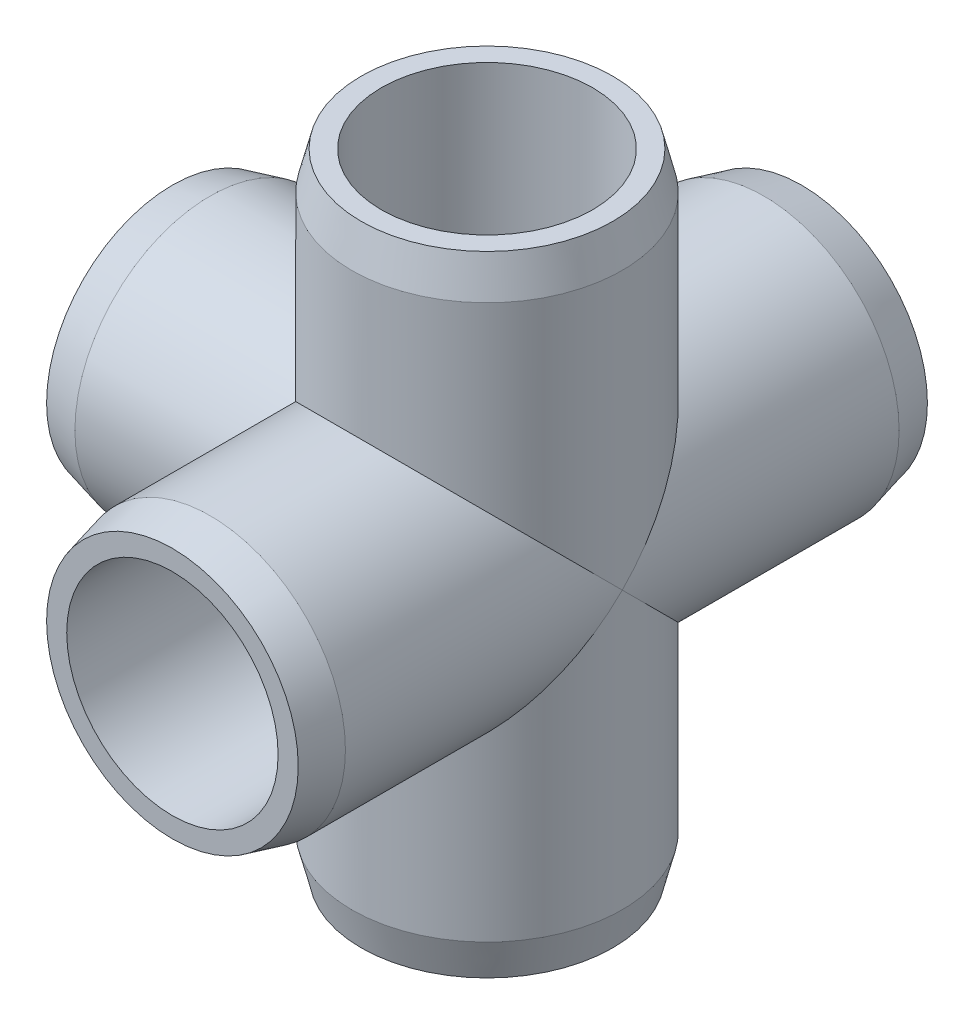
ISO-10303-21;
HEADER;
FILE_DESCRIPTION(('STEP AP214'),'2;1');
FILE_NAME('part.step','',(''),(''),'','','');
FILE_SCHEMA(('AUTOMOTIVE_DESIGN { 1 0 10303 214 1 1 1 1 }'));
ENDSEC;
DATA;
#1=APPLICATION_CONTEXT('core data for automotive mechanical design processes');
#2=APPLICATION_PROTOCOL_DEFINITION('international standard','automotive_design',2000,#1);
#3=PRODUCT_CONTEXT('',#1,'mechanical');
#4=PRODUCT('Part','Part','',(#3));
#5=PRODUCT_RELATED_PRODUCT_CATEGORY('part','',(#4));
#6=PRODUCT_DEFINITION_FORMATION('','',#4);
#7=PRODUCT_DEFINITION_CONTEXT('part definition',#1,'design');
#8=PRODUCT_DEFINITION('design','',#6,#7);
#9=PRODUCT_DEFINITION_SHAPE('','',#8);
#10=(LENGTH_UNIT() NAMED_UNIT(*) SI_UNIT(.MILLI.,.METRE.));
#11=(NAMED_UNIT(*) PLANE_ANGLE_UNIT() SI_UNIT($,.RADIAN.));
#12=(NAMED_UNIT(*) SI_UNIT($,.STERADIAN.) SOLID_ANGLE_UNIT());
#13=UNCERTAINTY_MEASURE_WITH_UNIT(LENGTH_MEASURE(1.E-05),#10,'distance_accuracy_value','');
#14=(GEOMETRIC_REPRESENTATION_CONTEXT(3) GLOBAL_UNCERTAINTY_ASSIGNED_CONTEXT((#13)) GLOBAL_UNIT_ASSIGNED_CONTEXT((#10,
#11,#12)) REPRESENTATION_CONTEXT('',''));
#15=CARTESIAN_POINT('',(0.,0.,0.));
#16=DIRECTION('',(0.,0.,1.));
#17=DIRECTION('',(1.,0.,0.));
#18=AXIS2_PLACEMENT_3D('',#15,#16,#17);
#19=CARTESIAN_POINT('',(-31.75,31.75,0.));
#20=DIRECTION('',(-1.,0.,0.));
#21=DIRECTION('',(0.,0.,1.));
#22=AXIS2_PLACEMENT_3D('',#19,#20,#21);
#23=CYLINDRICAL_SURFACE('',#22,10.4775);
#24=CARTESIAN_POINT('',(-12.7,31.75,0.));
#25=DIRECTION('',(-1.,0.,0.));
#26=DIRECTION('',(0.,0.,1.));
#27=AXIS2_PLACEMENT_3D('',#24,#25,#26);
#28=CIRCLE('',#27,10.4775);
#29=CARTESIAN_POINT('',(-12.7,31.75,10.4775));
#30=VERTEX_POINT('',#29);
#31=EDGE_CURVE('E54',#30,#30,#28,.T.);
#32=ORIENTED_EDGE('',*,*,#31,.F.);
#33=EDGE_LOOP('',(#32));
#34=FACE_BOUND('',#33,.T.);
#35=CARTESIAN_POINT('',(-10.795,31.75,0.));
#36=DIRECTION('',(-1.,0.,0.));
#37=DIRECTION('',(0.,0.,1.));
#38=AXIS2_PLACEMENT_3D('',#35,#36,#37);
#39=CIRCLE('',#38,10.4775);
#40=CARTESIAN_POINT('',(-10.795,31.75,10.4775));
#41=VERTEX_POINT('',#40);
#42=EDGE_CURVE('E11',#41,#41,#39,.T.);
#43=ORIENTED_EDGE('',*,*,#42,.T.);
#44=EDGE_LOOP('',(#43));
#45=FACE_BOUND('',#44,.T.);
#46=ADVANCED_FACE('F40',(#34,#45),#23,.T.);
#47=CARTESIAN_POINT('',(-10.795,42.2275,0.));
#48=DIRECTION('',(-1.,0.,0.));
#49=DIRECTION('',(0.,0.,1.));
#50=AXIS2_PLACEMENT_3D('',#47,#48,#49);
#51=PLANE('',#50);
#52=ORIENTED_EDGE('',*,*,#42,.F.);
#53=EDGE_LOOP('',(#52));
#54=FACE_BOUND('',#53,.T.);
#55=CARTESIAN_POINT('',(-10.795,31.75,0.));
#56=DIRECTION('',(-1.,0.,0.));
#57=DIRECTION('',(0.,0.,1.));
#58=AXIS2_PLACEMENT_3D('',#55,#56,#57);
#59=CIRCLE('',#58,9.2075);
#60=CARTESIAN_POINT('',(-10.795,31.75,9.2075));
#61=VERTEX_POINT('',#60);
#62=EDGE_CURVE('E46',#61,#61,#59,.T.);
#63=ORIENTED_EDGE('',*,*,#62,.T.);
#64=EDGE_LOOP('',(#63));
#65=FACE_BOUND('',#64,.T.);
#66=ADVANCED_FACE('F63',(#54,#65),#51,.F.);
#67=CARTESIAN_POINT('',(-31.75,31.75,0.));
#68=DIRECTION('',(-1.,0.,0.));
#69=DIRECTION('',(0.,0.,1.));
#70=AXIS2_PLACEMENT_3D('',#67,#68,#69);
#71=CYLINDRICAL_SURFACE('',#70,9.2075);
#72=ORIENTED_EDGE('',*,*,#62,.F.);
#73=EDGE_LOOP('',(#72));
#74=FACE_BOUND('',#73,.T.);
#75=CARTESIAN_POINT('',(-12.7,31.75,0.));
#76=DIRECTION('',(-1.,0.,0.));
#77=DIRECTION('',(0.,0.,1.));
#78=AXIS2_PLACEMENT_3D('',#75,#76,#77);
#79=CIRCLE('',#78,9.2075);
#80=CARTESIAN_POINT('',(-12.7,31.75,9.2075));
#81=VERTEX_POINT('',#80);
#82=EDGE_CURVE('E50',#81,#81,#79,.T.);
#83=ORIENTED_EDGE('',*,*,#82,.T.);
#84=EDGE_LOOP('',(#83));
#85=FACE_BOUND('',#84,.T.);
#86=ADVANCED_FACE('F67',(#74,#85),#71,.F.);
#87=CARTESIAN_POINT('',(-12.7,40.9575,0.));
#88=DIRECTION('',(1.,0.,0.));
#89=DIRECTION('',(0.,0.,-1.));
#90=AXIS2_PLACEMENT_3D('',#87,#88,#89);
#91=PLANE('',#90);
#92=ORIENTED_EDGE('',*,*,#82,.F.);
#93=EDGE_LOOP('',(#92));
#94=FACE_BOUND('',#93,.T.);
#95=ORIENTED_EDGE('',*,*,#31,.T.);
#96=EDGE_LOOP('',(#95));
#97=FACE_BOUND('',#96,.T.);
#98=ADVANCED_FACE('F60',(#94,#97),#91,.F.);
#99=CLOSED_SHELL('',(#46,#66,#86,#98));
#100=MANIFOLD_SOLID_BREP('B2',#99);
#101=CARTESIAN_POINT('',(0.,63.5,0.));
#102=DIRECTION('',(0.,-1.,0.));
#103=DIRECTION('',(0.,0.,-1.));
#104=AXIS2_PLACEMENT_3D('',#101,#102,#103);
#105=CYLINDRICAL_SURFACE('',#104,10.668);
#106=CARTESIAN_POINT('',(0.,31.75,0.));
#107=DIRECTION('',(-0.707106781186547,-0.707106781186547,0.));
#108=DIRECTION('',(0.707106781186547,-0.707106781186547,0.));
#109=AXIS2_PLACEMENT_3D('',#106,#107,#108);
#110=ELLIPSE('',#109,15.0868302833962,10.668);
#111=CARTESIAN_POINT('',(-7.54341514169809,39.2934151416981,-7.54341514169809));
#112=VERTEX_POINT('',#111);
#113=CARTESIAN_POINT('',(-7.54341514169809,39.2934151416981,7.54341514169808));
#114=VERTEX_POINT('',#113);
#115=EDGE_CURVE('E154',#112,#114,#110,.F.);
#116=ORIENTED_EDGE('',*,*,#115,.F.);
#117=CARTESIAN_POINT('',(0.,31.75,0.));
#118=DIRECTION('',(0.,0.707106781186548,0.707106781186547));
#119=DIRECTION('',(0.,-0.707106781186548,0.707106781186547));
#120=AXIS2_PLACEMENT_3D('',#117,#118,#119);
#121=ELLIPSE('',#120,15.0868302833962,10.668);
#122=CARTESIAN_POINT('',(10.668,31.75,0.));
#123=VERTEX_POINT('',#122);
#124=EDGE_CURVE('E151',#123,#112,#121,.T.);
#125=ORIENTED_EDGE('',*,*,#124,.F.);
#126=CARTESIAN_POINT('',(0.,31.75,0.));
#127=DIRECTION('',(0.,-0.707106781186548,0.707106781186547));
#128=DIRECTION('',(0.,0.707106781186548,0.707106781186547));
#129=AXIS2_PLACEMENT_3D('',#126,#127,#128);
#130=ELLIPSE('',#129,15.0868302833962,10.668);
#131=EDGE_CURVE('E38',#114,#123,#130,.F.);
#132=ORIENTED_EDGE('',*,*,#131,.F.);
#133=EDGE_LOOP('',(#116,#125,#132));
#134=FACE_BOUND('',#133,.T.);
#135=CARTESIAN_POINT('',(0.,42.545,0.));
#136=DIRECTION('',(0.,-1.,0.));
#137=DIRECTION('',(0.,0.,-1.));
#138=AXIS2_PLACEMENT_3D('',#135,#136,#137);
#139=CIRCLE('',#138,10.668);
#140=CARTESIAN_POINT('',(0.,42.545,-10.668));
#141=VERTEX_POINT('',#140);
#142=EDGE_CURVE('E275',#141,#141,#139,.T.);
#143=ORIENTED_EDGE('',*,*,#142,.F.);
#144=EDGE_LOOP('',(#143));
#145=FACE_BOUND('',#144,.T.);
#146=ADVANCED_FACE('F101',(#134,#145),#105,.F.);
#147=CARTESIAN_POINT('',(0.,63.5,0.));
#148=DIRECTION('',(0.,1.,0.));
#149=DIRECTION('',(0.,0.,1.));
#150=AXIS2_PLACEMENT_3D('',#147,#148,#149);
#151=CIRCLE('',#150,10.668);
#152=CARTESIAN_POINT('',(0.,63.5,10.668));
#153=VERTEX_POINT('',#152);
#154=EDGE_CURVE('E165',#153,#153,#151,.T.);
#155=ORIENTED_EDGE('',*,*,#154,.T.);
#156=EDGE_LOOP('',(#155));
#157=FACE_BOUND('',#156,.T.);
#158=CARTESIAN_POINT('',(0.,44.45,0.));
#159=DIRECTION('',(0.,-1.,0.));
#160=DIRECTION('',(0.,0.,-1.));
#161=AXIS2_PLACEMENT_3D('',#158,#159,#160);
#162=CIRCLE('',#161,10.668);
#163=CARTESIAN_POINT('',(0.,44.45,-10.668));
#164=VERTEX_POINT('',#163);
#165=EDGE_CURVE('E284',#164,#164,#162,.T.);
#166=ORIENTED_EDGE('',*,*,#165,.T.);
#167=EDGE_LOOP('',(#166));
#168=FACE_BOUND('',#167,.T.);
#169=ADVANCED_FACE('F288',(#157,#168),#105,.F.);
#170=CARTESIAN_POINT('',(0.,31.75,0.));
#171=DIRECTION('',(0.707106781186547,-0.707106781186547,0.));
#172=DIRECTION('',(-0.707106781186547,-0.707106781186547,0.));
#173=AXIS2_PLACEMENT_3D('',#170,#171,#172);
#174=ELLIPSE('',#173,15.0868302833962,10.668);
#175=CARTESIAN_POINT('',(-7.54341514169809,24.2065848583019,7.54341514169808));
#176=VERTEX_POINT('',#175);
#177=CARTESIAN_POINT('',(-7.54341514169809,24.2065848583019,-7.54341514169809));
#178=VERTEX_POINT('',#177);
#179=EDGE_CURVE('E116',#176,#178,#174,.T.);
#180=ORIENTED_EDGE('',*,*,#179,.F.);
#181=CARTESIAN_POINT('',(0.,31.75,0.));
#182=DIRECTION('',(0.,0.707106781186548,0.707106781186547));
#183=DIRECTION('',(0.,-0.707106781186548,0.707106781186547));
#184=AXIS2_PLACEMENT_3D('',#181,#182,#183);
#185=ELLIPSE('',#184,15.0868302833962,10.668);
#186=EDGE_CURVE('E159',#123,#176,#185,.F.);
#187=ORIENTED_EDGE('',*,*,#186,.F.);
#188=CARTESIAN_POINT('',(0.,31.75,0.));
#189=DIRECTION('',(0.,-0.707106781186548,0.707106781186547));
#190=DIRECTION('',(0.,0.707106781186548,0.707106781186547));
#191=AXIS2_PLACEMENT_3D('',#188,#189,#190);
#192=ELLIPSE('',#191,15.0868302833962,10.668);
#193=EDGE_CURVE('E109',#178,#123,#192,.T.);
#194=ORIENTED_EDGE('',*,*,#193,.F.);
#195=EDGE_LOOP('',(#180,#187,#194));
#196=FACE_BOUND('',#195,.T.);
#197=CARTESIAN_POINT('',(0.,20.955,0.));
#198=DIRECTION('',(0.,-1.,0.));
#199=DIRECTION('',(0.,0.,-1.));
#200=AXIS2_PLACEMENT_3D('',#197,#198,#199);
#201=CIRCLE('',#200,10.668);
#202=CARTESIAN_POINT('',(0.,20.955,-10.668));
#203=VERTEX_POINT('',#202);
#204=EDGE_CURVE('E263',#203,#203,#201,.T.);
#205=ORIENTED_EDGE('',*,*,#204,.T.);
#206=EDGE_LOOP('',(#205));
#207=FACE_BOUND('',#206,.T.);
#208=ADVANCED_FACE('F161',(#196,#207),#105,.F.);
#209=CARTESIAN_POINT('',(0.,0.,0.));
#210=DIRECTION('',(0.,1.,0.));
#211=DIRECTION('',(0.,0.,1.));
#212=AXIS2_PLACEMENT_3D('',#209,#210,#211);
#213=CIRCLE('',#212,10.668);
#214=CARTESIAN_POINT('',(0.,0.,10.668));
#215=VERTEX_POINT('',#214);
#216=EDGE_CURVE('E172',#215,#215,#213,.T.);
#217=ORIENTED_EDGE('',*,*,#216,.F.);
#218=EDGE_LOOP('',(#217));
#219=FACE_BOUND('',#218,.T.);
#220=CARTESIAN_POINT('',(0.,19.05,0.));
#221=DIRECTION('',(0.,-1.,0.));
#222=DIRECTION('',(0.,0.,-1.));
#223=AXIS2_PLACEMENT_3D('',#220,#221,#222);
#224=CIRCLE('',#223,10.668);
#225=CARTESIAN_POINT('',(0.,19.05,-10.668));
#226=VERTEX_POINT('',#225);
#227=EDGE_CURVE('E272',#226,#226,#224,.T.);
#228=ORIENTED_EDGE('',*,*,#227,.F.);
#229=EDGE_LOOP('',(#228));
#230=FACE_BOUND('',#229,.T.);
#231=ADVANCED_FACE('F303',(#219,#230),#105,.F.);
#232=CARTESIAN_POINT('',(0.,31.75,-38.1));
#233=DIRECTION('',(0.,0.,1.));
#234=DIRECTION('',(1.,0.,0.));
#235=AXIS2_PLACEMENT_3D('',#232,#233,#234);
#236=CYLINDRICAL_SURFACE('',#235,10.668);
#237=CARTESIAN_POINT('',(0.,31.75,12.7));
#238=DIRECTION('',(0.,0.,-1.));
#239=DIRECTION('',(0.,1.,0.));
#240=AXIS2_PLACEMENT_3D('',#237,#238,#239);
#241=CIRCLE('',#240,10.668);
#242=CARTESIAN_POINT('',(10.668,31.75,12.7));
#243=VERTEX_POINT('',#242);
#244=EDGE_CURVE('E251',#243,#243,#241,.T.);
#245=CARTESIAN_POINT('',(0.,31.75,31.75));
#246=DIRECTION('',(0.,0.,1.));
#247=DIRECTION('',(1.,0.,0.));
#248=AXIS2_PLACEMENT_3D('',#245,#246,#247);
#249=CIRCLE('',#248,10.668);
#250=CARTESIAN_POINT('',(10.668,31.75,31.75));
#251=VERTEX_POINT('',#250);
#252=EDGE_CURVE('E187',#251,#251,#249,.T.);
#253=CARTESIAN_POINT('',(10.668,31.75,12.7));
#254=CARTESIAN_POINT('',(10.668,31.75,12.8984375));
#255=CARTESIAN_POINT('',(10.668,31.75,13.096875));
#256=CARTESIAN_POINT('',(10.668,31.75,13.49375));
#257=CARTESIAN_POINT('',(10.668,31.75,13.6921875));
#258=CARTESIAN_POINT('',(10.668,31.75,14.0890625));
#259=CARTESIAN_POINT('',(10.668,31.75,14.2875));
#260=CARTESIAN_POINT('',(10.668,31.75,14.684375));
#261=CARTESIAN_POINT('',(10.668,31.75,14.8828125));
#262=CARTESIAN_POINT('',(10.668,31.75,15.2796875));
#263=CARTESIAN_POINT('',(10.668,31.75,15.478125));
#264=CARTESIAN_POINT('',(10.668,31.75,15.875));
#265=CARTESIAN_POINT('',(10.668,31.75,16.0734375));
#266=CARTESIAN_POINT('',(10.668,31.75,16.4703125));
#267=CARTESIAN_POINT('',(10.668,31.75,16.66875));
#268=CARTESIAN_POINT('',(10.668,31.75,17.065625));
#269=CARTESIAN_POINT('',(10.668,31.75,17.2640625));
#270=CARTESIAN_POINT('',(10.668,31.75,17.6609375));
#271=CARTESIAN_POINT('',(10.668,31.75,17.859375));
#272=CARTESIAN_POINT('',(10.668,31.75,18.25625));
#273=CARTESIAN_POINT('',(10.668,31.75,18.4546875));
#274=CARTESIAN_POINT('',(10.668,31.75,18.8515625));
#275=CARTESIAN_POINT('',(10.668,31.75,19.05));
#276=CARTESIAN_POINT('',(10.668,31.75,19.446875));
#277=CARTESIAN_POINT('',(10.668,31.75,19.6453125));
#278=CARTESIAN_POINT('',(10.668,31.75,20.0421875));
#279=CARTESIAN_POINT('',(10.668,31.75,20.240625));
#280=CARTESIAN_POINT('',(10.668,31.75,20.6375));
#281=CARTESIAN_POINT('',(10.668,31.75,20.8359375));
#282=CARTESIAN_POINT('',(10.668,31.75,21.2328125));
#283=CARTESIAN_POINT('',(10.668,31.75,21.43125));
#284=CARTESIAN_POINT('',(10.668,31.75,21.828125));
#285=CARTESIAN_POINT('',(10.668,31.75,22.0265625));
#286=CARTESIAN_POINT('',(10.668,31.75,22.4234375));
#287=CARTESIAN_POINT('',(10.668,31.75,22.621875));
#288=CARTESIAN_POINT('',(10.668,31.75,23.01875));
#289=CARTESIAN_POINT('',(10.668,31.75,23.2171875));
#290=CARTESIAN_POINT('',(10.668,31.75,23.6140625));
#291=CARTESIAN_POINT('',(10.668,31.75,23.8125));
#292=CARTESIAN_POINT('',(10.668,31.75,24.209375));
#293=CARTESIAN_POINT('',(10.668,31.75,24.4078125));
#294=CARTESIAN_POINT('',(10.668,31.75,24.8046875));
#295=CARTESIAN_POINT('',(10.668,31.75,25.003125));
#296=CARTESIAN_POINT('',(10.668,31.75,25.4));
#297=CARTESIAN_POINT('',(10.668,31.75,25.5984375));
#298=CARTESIAN_POINT('',(10.668,31.75,25.9953125));
#299=CARTESIAN_POINT('',(10.668,31.75,26.19375));
#300=CARTESIAN_POINT('',(10.668,31.75,26.590625));
#301=CARTESIAN_POINT('',(10.668,31.75,26.7890625));
#302=CARTESIAN_POINT('',(10.668,31.75,27.1859375));
#303=CARTESIAN_POINT('',(10.668,31.75,27.384375));
#304=CARTESIAN_POINT('',(10.668,31.75,27.78125));
#305=CARTESIAN_POINT('',(10.668,31.75,27.9796875));
#306=CARTESIAN_POINT('',(10.668,31.75,28.3765625));
#307=CARTESIAN_POINT('',(10.668,31.75,28.575));
#308=CARTESIAN_POINT('',(10.668,31.75,28.971875));
#309=CARTESIAN_POINT('',(10.668,31.75,29.1703125));
#310=CARTESIAN_POINT('',(10.668,31.75,29.5671875));
#311=CARTESIAN_POINT('',(10.668,31.75,29.765625));
#312=CARTESIAN_POINT('',(10.668,31.75,30.1625));
#313=CARTESIAN_POINT('',(10.668,31.75,30.3609375));
#314=CARTESIAN_POINT('',(10.668,31.75,30.7578125));
#315=CARTESIAN_POINT('',(10.668,31.75,30.95625));
#316=CARTESIAN_POINT('',(10.668,31.75,31.353125));
#317=CARTESIAN_POINT('',(10.668,31.75,31.5515625));
#318=CARTESIAN_POINT('',(10.668,31.75,31.75));
#319=B_SPLINE_CURVE_WITH_KNOTS('',3,(#253,#254,#255,#256,#257,#258,#259,#260,#261,#262,#263,
#264,#265,#266,#267,#268,#269,#270,#271,#272,#273,#274,#275,#276,#277,#278,#279,#280,#281,#282,
#283,#284,#285,#286,#287,#288,#289,#290,#291,#292,#293,#294,#295,#296,#297,#298,#299,#300,#301,
#302,#303,#304,#305,#306,#307,#308,#309,#310,#311,#312,#313,#314,#315,#316,#317,#318),
.UNSPECIFIED.,.F.,.F.,(4,2,2,2,2,2,2,2,2,2,2,2,2,2,2,2,2,2,2,2,2,2,2,2,2,2,2,2,2,2,2,2,4),(0.,
0.5953125,1.190625,1.7859375,2.38125,2.9765625,3.571875,4.1671875,4.7625,5.3578125,5.953125,
6.5484375,7.14375,7.7390625,8.334375,8.92968750000001,9.52500000000001,10.1203125,10.715625,
11.3109375,11.90625,12.5015625,13.096875,13.6921875,14.2875,14.8828125,15.478125,16.0734375,
16.66875,17.2640625,17.859375,18.4546875,19.05),.UNSPECIFIED.);
#320=EDGE_CURVE('BSEAM311',#243,#251,#319,.T.);
#321=ORIENTED_EDGE('',*,*,#244,.T.);
#322=ORIENTED_EDGE('',*,*,#252,.T.);
#323=ORIENTED_EDGE('',*,*,#320,.T.);
#324=ORIENTED_EDGE('',*,*,#320,.F.);
#325=EDGE_LOOP('',(#321,#323,#322,#324));
#326=FACE_BOUND('',#325,.T.);
#327=ADVANCED_FACE('F311',(#326),#236,.F.);
#328=CARTESIAN_POINT('',(0.,31.75,10.795));
#329=DIRECTION('',(0.,0.,-1.));
#330=DIRECTION('',(0.,1.,0.));
#331=AXIS2_PLACEMENT_3D('',#328,#329,#330);
#332=CIRCLE('',#331,10.668);
#333=CARTESIAN_POINT('',(0.,42.418,10.795));
#334=VERTEX_POINT('',#333);
#335=EDGE_CURVE('E260',#334,#334,#332,.T.);
#336=ORIENTED_EDGE('',*,*,#335,.F.);
#337=EDGE_LOOP('',(#336));
#338=FACE_BOUND('',#337,.T.);
#339=CARTESIAN_POINT('',(0.,31.75,0.));
#340=DIRECTION('',(0.707106781186548,0.,0.707106781186547));
#341=DIRECTION('',(-0.707106781186548,0.,0.707106781186547));
#342=AXIS2_PLACEMENT_3D('',#339,#340,#341);
#343=ELLIPSE('',#342,15.0868302833962,10.668);
#344=EDGE_CURVE('E168',#176,#114,#343,.F.);
#345=ORIENTED_EDGE('',*,*,#344,.T.);
#346=ORIENTED_EDGE('',*,*,#131,.T.);
#347=ORIENTED_EDGE('',*,*,#186,.T.);
#348=EDGE_LOOP('',(#345,#346,#347));
#349=FACE_BOUND('',#348,.T.);
#350=ADVANCED_FACE('F167',(#338,#349),#236,.F.);
#351=CARTESIAN_POINT('',(0.,63.5,0.));
#352=DIRECTION('',(0.,-1.,0.));
#353=DIRECTION('',(0.,0.,-1.));
#354=AXIS2_PLACEMENT_3D('',#351,#352,#353);
#355=CYLINDRICAL_SURFACE('',#354,13.6525);
#356=CARTESIAN_POINT('',(0.,31.75,0.));
#357=DIRECTION('',(-0.707106781186547,-0.707106781186547,0.));
#358=DIRECTION('',(-0.707106781186547,0.707106781186547,0.));
#359=AXIS2_PLACEMENT_3D('',#356,#357,#358);
#360=ELLIPSE('',#359,19.3075506602987,13.6525);
#361=CARTESIAN_POINT('',(-9.65377533014934,41.4037753301493,-9.65377533014934));
#362=VERTEX_POINT('',#361);
#363=CARTESIAN_POINT('',(-9.65377533014934,41.4037753301493,9.65377533014934));
#364=VERTEX_POINT('',#363);
#365=EDGE_CURVE('E124',#362,#364,#360,.F.);
#366=ORIENTED_EDGE('',*,*,#365,.T.);
#367=CARTESIAN_POINT('',(0.,31.75,0.));
#368=DIRECTION('',(0.,-0.707106781186547,0.707106781186547));
#369=DIRECTION('',(0.,-0.707106781186547,-0.707106781186547));
#370=AXIS2_PLACEMENT_3D('',#367,#368,#369);
#371=ELLIPSE('',#370,19.3075506602987,13.6525);
#372=CARTESIAN_POINT('',(13.6525,31.75,0.));
#373=VERTEX_POINT('',#372);
#374=EDGE_CURVE('E182',#373,#364,#371,.T.);
#375=ORIENTED_EDGE('',*,*,#374,.F.);
#376=CARTESIAN_POINT('',(0.,31.75,0.));
#377=DIRECTION('',(0.,-0.707106781186547,-0.707106781186547));
#378=DIRECTION('',(0.,-0.707106781186547,0.707106781186547));
#379=AXIS2_PLACEMENT_3D('',#376,#377,#378);
#380=ELLIPSE('',#379,19.3075506602987,13.6525);
#381=EDGE_CURVE('E180',#362,#373,#380,.T.);
#382=ORIENTED_EDGE('',*,*,#381,.F.);
#383=EDGE_LOOP('',(#366,#375,#382));
#384=FACE_BOUND('',#383,.T.);
#385=CARTESIAN_POINT('',(0.,59.69,0.));
#386=DIRECTION('',(0.,-1.,0.));
#387=DIRECTION('',(0.,0.,-1.));
#388=AXIS2_PLACEMENT_3D('',#385,#386,#387);
#389=CIRCLE('',#388,13.6525);
#390=CARTESIAN_POINT('',(0.,59.69,-13.6525));
#391=VERTEX_POINT('',#390);
#392=EDGE_CURVE('E227',#391,#391,#389,.T.);
#393=ORIENTED_EDGE('',*,*,#392,.T.);
#394=EDGE_LOOP('',(#393));
#395=FACE_BOUND('',#394,.T.);
#396=ADVANCED_FACE('F103',(#384,#395),#355,.T.);
#397=CARTESIAN_POINT('',(0.,63.5,0.));
#398=DIRECTION('',(0.,1.,0.));
#399=DIRECTION('',(0.,0.,1.));
#400=AXIS2_PLACEMENT_3D('',#397,#398,#399);
#401=PLANE('',#400);
#402=ORIENTED_EDGE('',*,*,#154,.F.);
#403=EDGE_LOOP('',(#402));
#404=FACE_BOUND('',#403,.T.);
#405=CARTESIAN_POINT('',(0.,63.5,0.));
#406=DIRECTION('',(0.,-1.,0.));
#407=DIRECTION('',(0.,0.,-1.));
#408=AXIS2_PLACEMENT_3D('',#405,#406,#407);
#409=CIRCLE('',#408,12.7);
#410=CARTESIAN_POINT('',(0.,63.5,-12.7));
#411=VERTEX_POINT('',#410);
#412=EDGE_CURVE('E230',#411,#411,#409,.T.);
#413=ORIENTED_EDGE('',*,*,#412,.F.);
#414=EDGE_LOOP('',(#413));
#415=FACE_BOUND('',#414,.T.);
#416=ADVANCED_FACE('F429',(#404,#415),#401,.T.);
#417=CARTESIAN_POINT('',(0.,31.75,0.));
#418=DIRECTION('',(-0.707106781186547,0.707106781186547,0.));
#419=DIRECTION('',(-0.707106781186547,-0.707106781186547,0.));
#420=AXIS2_PLACEMENT_3D('',#417,#418,#419);
#421=ELLIPSE('',#420,19.3075506602987,13.6525);
#422=CARTESIAN_POINT('',(-9.65377533014934,22.0962246698507,9.65377533014934));
#423=VERTEX_POINT('',#422);
#424=CARTESIAN_POINT('',(-9.65377533014934,22.0962246698507,-9.65377533014934));
#425=VERTEX_POINT('',#424);
#426=EDGE_CURVE('E203',#423,#425,#421,.F.);
#427=ORIENTED_EDGE('',*,*,#426,.T.);
#428=CARTESIAN_POINT('',(0.,31.75,0.));
#429=DIRECTION('',(0.,-0.707106781186547,0.707106781186547));
#430=DIRECTION('',(0.,-0.707106781186547,-0.707106781186547));
#431=AXIS2_PLACEMENT_3D('',#428,#429,#430);
#432=ELLIPSE('',#431,19.3075506602987,13.6525);
#433=EDGE_CURVE('E184',#373,#425,#432,.F.);
#434=ORIENTED_EDGE('',*,*,#433,.F.);
#435=CARTESIAN_POINT('',(0.,31.75,0.));
#436=DIRECTION('',(0.,-0.707106781186547,-0.707106781186547));
#437=DIRECTION('',(0.,-0.707106781186547,0.707106781186547));
#438=AXIS2_PLACEMENT_3D('',#435,#436,#437);
#439=ELLIPSE('',#438,19.3075506602987,13.6525);
#440=EDGE_CURVE('E175',#423,#373,#439,.F.);
#441=ORIENTED_EDGE('',*,*,#440,.F.);
#442=EDGE_LOOP('',(#427,#434,#441));
#443=FACE_BOUND('',#442,.T.);
#444=CARTESIAN_POINT('',(0.,3.81,0.));
#445=DIRECTION('',(0.,-1.,0.));
#446=DIRECTION('',(0.,0.,-1.));
#447=AXIS2_PLACEMENT_3D('',#444,#445,#446);
#448=CIRCLE('',#447,13.6525);
#449=CARTESIAN_POINT('',(0.,3.81,-13.6525));
#450=VERTEX_POINT('',#449);
#451=EDGE_CURVE('E221',#450,#450,#448,.T.);
#452=ORIENTED_EDGE('',*,*,#451,.F.);
#453=EDGE_LOOP('',(#452));
#454=FACE_BOUND('',#453,.T.);
#455=ADVANCED_FACE('F420',(#443,#454),#355,.T.);
#456=CARTESIAN_POINT('',(0.,0.,0.));
#457=DIRECTION('',(0.,1.,0.));
#458=DIRECTION('',(0.,0.,1.));
#459=AXIS2_PLACEMENT_3D('',#456,#457,#458);
#460=PLANE('',#459);
#461=ORIENTED_EDGE('',*,*,#216,.T.);
#462=EDGE_LOOP('',(#461));
#463=FACE_BOUND('',#462,.T.);
#464=CARTESIAN_POINT('',(0.,0.,0.));
#465=DIRECTION('',(0.,-1.,0.));
#466=DIRECTION('',(0.,0.,-1.));
#467=AXIS2_PLACEMENT_3D('',#464,#465,#466);
#468=CIRCLE('',#467,12.7);
#469=CARTESIAN_POINT('',(0.,0.,-12.7));
#470=VERTEX_POINT('',#469);
#471=EDGE_CURVE('E224',#470,#470,#468,.T.);
#472=ORIENTED_EDGE('',*,*,#471,.T.);
#473=EDGE_LOOP('',(#472));
#474=FACE_BOUND('',#473,.T.);
#475=ADVANCED_FACE('F415',(#463,#474),#460,.F.);
#476=CARTESIAN_POINT('',(0.,31.75,-12.7));
#477=DIRECTION('',(0.,0.,-1.));
#478=DIRECTION('',(0.,1.,0.));
#479=AXIS2_PLACEMENT_3D('',#476,#477,#478);
#480=CIRCLE('',#479,10.668);
#481=CARTESIAN_POINT('',(10.668,31.75,-12.7));
#482=VERTEX_POINT('',#481);
#483=EDGE_CURVE('E209',#482,#482,#480,.T.);
#484=CARTESIAN_POINT('',(0.,31.75,-31.75));
#485=DIRECTION('',(0.,0.,1.));
#486=DIRECTION('',(1.,0.,0.));
#487=AXIS2_PLACEMENT_3D('',#484,#485,#486);
#488=CIRCLE('',#487,10.668);
#489=CARTESIAN_POINT('',(10.668,31.75,-31.75));
#490=VERTEX_POINT('',#489);
#491=EDGE_CURVE('E188',#490,#490,#488,.T.);
#492=CARTESIAN_POINT('',(10.668,31.75,-12.7));
#493=CARTESIAN_POINT('',(10.668,31.75,-12.8984375));
#494=CARTESIAN_POINT('',(10.668,31.75,-13.096875));
#495=CARTESIAN_POINT('',(10.668,31.75,-13.49375));
#496=CARTESIAN_POINT('',(10.668,31.75,-13.6921875));
#497=CARTESIAN_POINT('',(10.668,31.75,-14.0890625));
#498=CARTESIAN_POINT('',(10.668,31.75,-14.2875));
#499=CARTESIAN_POINT('',(10.668,31.75,-14.684375));
#500=CARTESIAN_POINT('',(10.668,31.75,-14.8828125));
#501=CARTESIAN_POINT('',(10.668,31.75,-15.2796875));
#502=CARTESIAN_POINT('',(10.668,31.75,-15.478125));
#503=CARTESIAN_POINT('',(10.668,31.75,-15.875));
#504=CARTESIAN_POINT('',(10.668,31.75,-16.0734375));
#505=CARTESIAN_POINT('',(10.668,31.75,-16.4703125));
#506=CARTESIAN_POINT('',(10.668,31.75,-16.66875));
#507=CARTESIAN_POINT('',(10.668,31.75,-17.065625));
#508=CARTESIAN_POINT('',(10.668,31.75,-17.2640625));
#509=CARTESIAN_POINT('',(10.668,31.75,-17.6609375));
#510=CARTESIAN_POINT('',(10.668,31.75,-17.859375));
#511=CARTESIAN_POINT('',(10.668,31.75,-18.25625));
#512=CARTESIAN_POINT('',(10.668,31.75,-18.4546875));
#513=CARTESIAN_POINT('',(10.668,31.75,-18.8515625));
#514=CARTESIAN_POINT('',(10.668,31.75,-19.05));
#515=CARTESIAN_POINT('',(10.668,31.75,-19.446875));
#516=CARTESIAN_POINT('',(10.668,31.75,-19.6453125));
#517=CARTESIAN_POINT('',(10.668,31.75,-20.0421875));
#518=CARTESIAN_POINT('',(10.668,31.75,-20.240625));
#519=CARTESIAN_POINT('',(10.668,31.75,-20.6375));
#520=CARTESIAN_POINT('',(10.668,31.75,-20.8359375));
#521=CARTESIAN_POINT('',(10.668,31.75,-21.2328125));
#522=CARTESIAN_POINT('',(10.668,31.75,-21.43125));
#523=CARTESIAN_POINT('',(10.668,31.75,-21.828125));
#524=CARTESIAN_POINT('',(10.668,31.75,-22.0265625));
#525=CARTESIAN_POINT('',(10.668,31.75,-22.4234375));
#526=CARTESIAN_POINT('',(10.668,31.75,-22.621875));
#527=CARTESIAN_POINT('',(10.668,31.75,-23.01875));
#528=CARTESIAN_POINT('',(10.668,31.75,-23.2171875));
#529=CARTESIAN_POINT('',(10.668,31.75,-23.6140625));
#530=CARTESIAN_POINT('',(10.668,31.75,-23.8125));
#531=CARTESIAN_POINT('',(10.668,31.75,-24.209375));
#532=CARTESIAN_POINT('',(10.668,31.75,-24.4078125));
#533=CARTESIAN_POINT('',(10.668,31.75,-24.8046875));
#534=CARTESIAN_POINT('',(10.668,31.75,-25.003125));
#535=CARTESIAN_POINT('',(10.668,31.75,-25.4));
#536=CARTESIAN_POINT('',(10.668,31.75,-25.5984375));
#537=CARTESIAN_POINT('',(10.668,31.75,-25.9953125));
#538=CARTESIAN_POINT('',(10.668,31.75,-26.19375));
#539=CARTESIAN_POINT('',(10.668,31.75,-26.590625));
#540=CARTESIAN_POINT('',(10.668,31.75,-26.7890625));
#541=CARTESIAN_POINT('',(10.668,31.75,-27.1859375));
#542=CARTESIAN_POINT('',(10.668,31.75,-27.384375));
#543=CARTESIAN_POINT('',(10.668,31.75,-27.78125));
#544=CARTESIAN_POINT('',(10.668,31.75,-27.9796875));
#545=CARTESIAN_POINT('',(10.668,31.75,-28.3765625));
#546=CARTESIAN_POINT('',(10.668,31.75,-28.575));
#547=CARTESIAN_POINT('',(10.668,31.75,-28.971875));
#548=CARTESIAN_POINT('',(10.668,31.75,-29.1703125));
#549=CARTESIAN_POINT('',(10.668,31.75,-29.5671875));
#550=CARTESIAN_POINT('',(10.668,31.75,-29.765625));
#551=CARTESIAN_POINT('',(10.668,31.75,-30.1625));
#552=CARTESIAN_POINT('',(10.668,31.75,-30.3609375));
#553=CARTESIAN_POINT('',(10.668,31.75,-30.7578125));
#554=CARTESIAN_POINT('',(10.668,31.75,-30.95625));
#555=CARTESIAN_POINT('',(10.668,31.75,-31.353125));
#556=CARTESIAN_POINT('',(10.668,31.75,-31.5515625));
#557=CARTESIAN_POINT('',(10.668,31.75,-31.75));
#558=B_SPLINE_CURVE_WITH_KNOTS('',3,(#492,#493,#494,#495,#496,#497,#498,#499,#500,#501,#502,
#503,#504,#505,#506,#507,#508,#509,#510,#511,#512,#513,#514,#515,#516,#517,#518,#519,#520,#521,
#522,#523,#524,#525,#526,#527,#528,#529,#530,#531,#532,#533,#534,#535,#536,#537,#538,#539,#540,
#541,#542,#543,#544,#545,#546,#547,#548,#549,#550,#551,#552,#553,#554,#555,#556,#557),
.UNSPECIFIED.,.F.,.F.,(4,2,2,2,2,2,2,2,2,2,2,2,2,2,2,2,2,2,2,2,2,2,2,2,2,2,2,2,2,2,2,2,4),(0.,
0.5953125,1.190625,1.7859375,2.38125,2.9765625,3.571875,4.1671875,4.7625,5.3578125,5.953125,
6.5484375,7.14375,7.7390625,8.334375,8.92968750000001,9.52500000000001,10.1203125,10.715625,
11.3109375,11.90625,12.5015625,13.096875,13.6921875,14.2875,14.8828125,15.478125,16.0734375,
16.66875,17.2640625,17.859375,18.4546875,19.05),.UNSPECIFIED.);
#559=EDGE_CURVE('BSEAM397',#482,#490,#558,.T.);
#560=ORIENTED_EDGE('',*,*,#483,.F.);
#561=ORIENTED_EDGE('',*,*,#491,.F.);
#562=ORIENTED_EDGE('',*,*,#559,.T.);
#563=ORIENTED_EDGE('',*,*,#559,.F.);
#564=EDGE_LOOP('',(#560,#562,#561,#563));
#565=FACE_BOUND('',#564,.T.);
#566=ADVANCED_FACE('F397',(#565),#236,.F.);
#567=CARTESIAN_POINT('',(-69.85,31.75,0.));
#568=DIRECTION('',(1.,0.,0.));
#569=DIRECTION('',(0.,0.,-1.));
#570=AXIS2_PLACEMENT_3D('',#567,#568,#569);
#571=CYLINDRICAL_SURFACE('',#570,10.668);
#572=ORIENTED_EDGE('',*,*,#344,.F.);
#573=ORIENTED_EDGE('',*,*,#179,.T.);
#574=CARTESIAN_POINT('',(0.,31.75,0.));
#575=DIRECTION('',(-0.707106781186548,0.,0.707106781186547));
#576=DIRECTION('',(0.707106781186548,0.,0.707106781186547));
#577=AXIS2_PLACEMENT_3D('',#574,#575,#576);
#578=ELLIPSE('',#577,15.0868302833962,10.668);
#579=EDGE_CURVE('E170',#112,#178,#578,.T.);
#580=ORIENTED_EDGE('',*,*,#579,.F.);
#581=ORIENTED_EDGE('',*,*,#115,.T.);
#582=EDGE_LOOP('',(#572,#573,#580,#581));
#583=FACE_BOUND('',#582,.T.);
#584=CARTESIAN_POINT('',(-31.75,31.75,0.));
#585=DIRECTION('',(1.,0.,0.));
#586=DIRECTION('',(0.,0.,-1.));
#587=AXIS2_PLACEMENT_3D('',#584,#585,#586);
#588=CIRCLE('',#587,10.668);
#589=CARTESIAN_POINT('',(-31.75,31.75,-10.668));
#590=VERTEX_POINT('',#589);
#591=EDGE_CURVE('E205',#590,#590,#588,.T.);
#592=ORIENTED_EDGE('',*,*,#591,.F.);
#593=EDGE_LOOP('',(#592));
#594=FACE_BOUND('',#593,.T.);
#595=ADVANCED_FACE('F393',(#583,#594),#571,.F.);
#596=CARTESIAN_POINT('',(0.,31.75,31.75));
#597=DIRECTION('',(0.,0.,-1.));
#598=DIRECTION('',(-1.,0.,0.));
#599=AXIS2_PLACEMENT_3D('',#596,#597,#598);
#600=CYLINDRICAL_SURFACE('',#599,13.6525);
#601=CARTESIAN_POINT('',(0.,31.75,27.94));
#602=DIRECTION('',(0.,0.,-1.));
#603=DIRECTION('',(-1.,0.,0.));
#604=AXIS2_PLACEMENT_3D('',#601,#602,#603);
#605=CIRCLE('',#604,13.6525);
#606=CARTESIAN_POINT('',(-13.6525,31.75,27.94));
#607=VERTEX_POINT('',#606);
#608=EDGE_CURVE('E248',#607,#607,#605,.T.);
#609=ORIENTED_EDGE('',*,*,#608,.T.);
#610=EDGE_LOOP('',(#609));
#611=FACE_BOUND('',#610,.T.);
#612=CARTESIAN_POINT('',(0.,31.75,0.));
#613=DIRECTION('',(-0.707106781186547,0.,-0.707106781186547));
#614=DIRECTION('',(0.707106781186547,0.,-0.707106781186547));
#615=AXIS2_PLACEMENT_3D('',#612,#613,#614);
#616=ELLIPSE('',#615,19.3075506602987,13.6525);
#617=EDGE_CURVE('E197',#423,#364,#616,.T.);
#618=ORIENTED_EDGE('',*,*,#617,.F.);
#619=ORIENTED_EDGE('',*,*,#440,.T.);
#620=ORIENTED_EDGE('',*,*,#374,.T.);
#621=EDGE_LOOP('',(#618,#619,#620));
#622=FACE_BOUND('',#621,.T.);
#623=ADVANCED_FACE('F396',(#611,#622),#600,.T.);
#624=CARTESIAN_POINT('',(0.,31.75,-27.94));
#625=DIRECTION('',(0.,0.,-1.));
#626=DIRECTION('',(-1.,0.,0.));
#627=AXIS2_PLACEMENT_3D('',#624,#625,#626);
#628=CIRCLE('',#627,13.6525);
#629=CARTESIAN_POINT('',(-13.6525,31.75,-27.94));
#630=VERTEX_POINT('',#629);
#631=EDGE_CURVE('E236',#630,#630,#628,.T.);
#632=ORIENTED_EDGE('',*,*,#631,.F.);
#633=EDGE_LOOP('',(#632));
#634=FACE_BOUND('',#633,.T.);
#635=CARTESIAN_POINT('',(0.,31.75,0.));
#636=DIRECTION('',(0.707106781186547,0.,-0.707106781186547));
#637=DIRECTION('',(-0.707106781186547,0.,-0.707106781186547));
#638=AXIS2_PLACEMENT_3D('',#635,#636,#637);
#639=ELLIPSE('',#638,19.3075506602987,13.6525);
#640=EDGE_CURVE('E200',#362,#425,#639,.F.);
#641=ORIENTED_EDGE('',*,*,#640,.F.);
#642=ORIENTED_EDGE('',*,*,#381,.T.);
#643=ORIENTED_EDGE('',*,*,#433,.T.);
#644=EDGE_LOOP('',(#641,#642,#643));
#645=FACE_BOUND('',#644,.T.);
#646=ADVANCED_FACE('F403',(#634,#645),#600,.T.);
#647=CARTESIAN_POINT('',(0.,31.75,31.75));
#648=DIRECTION('',(0.,0.,1.));
#649=DIRECTION('',(1.,0.,0.));
#650=AXIS2_PLACEMENT_3D('',#647,#648,#649);
#651=PLANE('',#650);
#652=CARTESIAN_POINT('',(0.,31.75,31.75));
#653=DIRECTION('',(0.,0.,-1.));
#654=DIRECTION('',(-1.,0.,0.));
#655=AXIS2_PLACEMENT_3D('',#652,#653,#654);
#656=CIRCLE('',#655,12.7);
#657=CARTESIAN_POINT('',(-12.7,31.75,31.75));
#658=VERTEX_POINT('',#657);
#659=EDGE_CURVE('E245',#658,#658,#656,.T.);
#660=ORIENTED_EDGE('',*,*,#659,.F.);
#661=EDGE_LOOP('',(#660));
#662=FACE_BOUND('',#661,.T.);
#663=ORIENTED_EDGE('',*,*,#252,.F.);
#664=EDGE_LOOP('',(#663));
#665=FACE_BOUND('',#664,.T.);
#666=ADVANCED_FACE('F399',(#662,#665),#651,.T.);
#667=CARTESIAN_POINT('',(0.,31.75,-31.75));
#668=DIRECTION('',(0.,0.,1.));
#669=DIRECTION('',(1.,0.,0.));
#670=AXIS2_PLACEMENT_3D('',#667,#668,#669);
#671=PLANE('',#670);
#672=CARTESIAN_POINT('',(0.,31.75,-31.75));
#673=DIRECTION('',(0.,0.,-1.));
#674=DIRECTION('',(-1.,0.,0.));
#675=AXIS2_PLACEMENT_3D('',#672,#673,#674);
#676=CIRCLE('',#675,12.7);
#677=CARTESIAN_POINT('',(-12.7,31.75,-31.75));
#678=VERTEX_POINT('',#677);
#679=EDGE_CURVE('E233',#678,#678,#676,.T.);
#680=ORIENTED_EDGE('',*,*,#679,.T.);
#681=EDGE_LOOP('',(#680));
#682=FACE_BOUND('',#681,.T.);
#683=ORIENTED_EDGE('',*,*,#491,.T.);
#684=EDGE_LOOP('',(#683));
#685=FACE_BOUND('',#684,.T.);
#686=ADVANCED_FACE('F402',(#682,#685),#671,.F.);
#687=CARTESIAN_POINT('',(0.,31.75,-10.795));
#688=DIRECTION('',(0.,0.,-1.));
#689=DIRECTION('',(0.,1.,0.));
#690=AXIS2_PLACEMENT_3D('',#687,#688,#689);
#691=CIRCLE('',#690,10.668);
#692=CARTESIAN_POINT('',(0.,42.418,-10.795));
#693=VERTEX_POINT('',#692);
#694=EDGE_CURVE('E218',#693,#693,#691,.T.);
#695=ORIENTED_EDGE('',*,*,#694,.T.);
#696=EDGE_LOOP('',(#695));
#697=FACE_BOUND('',#696,.T.);
#698=ORIENTED_EDGE('',*,*,#579,.T.);
#699=ORIENTED_EDGE('',*,*,#193,.T.);
#700=ORIENTED_EDGE('',*,*,#124,.T.);
#701=EDGE_LOOP('',(#698,#699,#700));
#702=FACE_BOUND('',#701,.T.);
#703=ADVANCED_FACE('F169',(#697,#702),#236,.F.);
#704=CARTESIAN_POINT('',(13.6535,31.75,0.));
#705=DIRECTION('',(-1.,0.,0.));
#706=DIRECTION('',(0.,0.,1.));
#707=AXIS2_PLACEMENT_3D('',#704,#705,#706);
#708=CYLINDRICAL_SURFACE('',#707,13.6525);
#709=CARTESIAN_POINT('',(-27.94,31.75,0.));
#710=DIRECTION('',(-1.,0.,0.));
#711=DIRECTION('',(0.,0.,1.));
#712=AXIS2_PLACEMENT_3D('',#709,#710,#711);
#713=CIRCLE('',#712,13.6525);
#714=CARTESIAN_POINT('',(-27.94,31.75,13.6525));
#715=VERTEX_POINT('',#714);
#716=EDGE_CURVE('E242',#715,#715,#713,.T.);
#717=ORIENTED_EDGE('',*,*,#716,.F.);
#718=EDGE_LOOP('',(#717));
#719=FACE_BOUND('',#718,.T.);
#720=ORIENTED_EDGE('',*,*,#426,.F.);
#721=ORIENTED_EDGE('',*,*,#617,.T.);
#722=ORIENTED_EDGE('',*,*,#365,.F.);
#723=ORIENTED_EDGE('',*,*,#640,.T.);
#724=EDGE_LOOP('',(#720,#721,#722,#723));
#725=FACE_BOUND('',#724,.T.);
#726=ADVANCED_FACE('F388',(#719,#725),#708,.T.);
#727=CARTESIAN_POINT('',(-31.75,31.75,0.));
#728=DIRECTION('',(1.,0.,0.));
#729=DIRECTION('',(0.,0.,-1.));
#730=AXIS2_PLACEMENT_3D('',#727,#728,#729);
#731=PLANE('',#730);
#732=CARTESIAN_POINT('',(-31.75,31.75,0.));
#733=DIRECTION('',(-1.,0.,0.));
#734=DIRECTION('',(0.,0.,1.));
#735=AXIS2_PLACEMENT_3D('',#732,#733,#734);
#736=CIRCLE('',#735,12.7);
#737=CARTESIAN_POINT('',(-31.75,31.75,12.7));
#738=VERTEX_POINT('',#737);
#739=EDGE_CURVE('E239',#738,#738,#736,.T.);
#740=ORIENTED_EDGE('',*,*,#739,.T.);
#741=EDGE_LOOP('',(#740));
#742=FACE_BOUND('',#741,.T.);
#743=ORIENTED_EDGE('',*,*,#591,.T.);
#744=EDGE_LOOP('',(#743));
#745=FACE_BOUND('',#744,.T.);
#746=ADVANCED_FACE('F384',(#742,#745),#731,.F.);
#747=CARTESIAN_POINT('',(0.,42.418,-12.7));
#748=DIRECTION('',(0.,0.,-1.));
#749=DIRECTION('',(0.,1.,0.));
#750=AXIS2_PLACEMENT_3D('',#747,#748,#749);
#751=PLANE('',#750);
#752=ORIENTED_EDGE('',*,*,#483,.T.);
#753=EDGE_LOOP('',(#752));
#754=FACE_BOUND('',#753,.T.);
#755=CARTESIAN_POINT('',(0.,31.75,-12.7));
#756=DIRECTION('',(0.,0.,-1.));
#757=DIRECTION('',(0.,1.,0.));
#758=AXIS2_PLACEMENT_3D('',#755,#756,#757);
#759=CIRCLE('',#758,9.398);
#760=CARTESIAN_POINT('',(0.,41.148,-12.7));
#761=VERTEX_POINT('',#760);
#762=EDGE_CURVE('E212',#761,#761,#759,.T.);
#763=ORIENTED_EDGE('',*,*,#762,.F.);
#764=EDGE_LOOP('',(#763));
#765=FACE_BOUND('',#764,.T.);
#766=ADVANCED_FACE('F380',(#754,#765),#751,.T.);
#767=CARTESIAN_POINT('',(0.,31.75,-31.75));
#768=DIRECTION('',(0.,0.,-1.));
#769=DIRECTION('',(0.,1.,0.));
#770=AXIS2_PLACEMENT_3D('',#767,#768,#769);
#771=CYLINDRICAL_SURFACE('',#770,9.398);
#772=ORIENTED_EDGE('',*,*,#762,.T.);
#773=EDGE_LOOP('',(#772));
#774=FACE_BOUND('',#773,.T.);
#775=CARTESIAN_POINT('',(0.,31.75,-10.795));
#776=DIRECTION('',(0.,0.,-1.));
#777=DIRECTION('',(0.,1.,0.));
#778=AXIS2_PLACEMENT_3D('',#775,#776,#777);
#779=CIRCLE('',#778,9.398);
#780=CARTESIAN_POINT('',(0.,41.148,-10.795));
#781=VERTEX_POINT('',#780);
#782=EDGE_CURVE('E215',#781,#781,#779,.T.);
#783=ORIENTED_EDGE('',*,*,#782,.F.);
#784=EDGE_LOOP('',(#783));
#785=FACE_BOUND('',#784,.T.);
#786=ADVANCED_FACE('F376',(#774,#785),#771,.F.);
#787=CARTESIAN_POINT('',(0.,41.148,-10.795));
#788=DIRECTION('',(0.,0.,1.));
#789=DIRECTION('',(0.,-1.,0.));
#790=AXIS2_PLACEMENT_3D('',#787,#788,#789);
#791=PLANE('',#790);
#792=ORIENTED_EDGE('',*,*,#782,.T.);
#793=EDGE_LOOP('',(#792));
#794=FACE_BOUND('',#793,.T.);
#795=ORIENTED_EDGE('',*,*,#694,.F.);
#796=EDGE_LOOP('',(#795));
#797=FACE_BOUND('',#796,.T.);
#798=ADVANCED_FACE('F372',(#794,#797),#791,.T.);
#799=CARTESIAN_POINT('',(0.,0.,0.));
#800=DIRECTION('',(0.,1.,0.));
#801=DIRECTION('',(0.,0.,1.));
#802=AXIS2_PLACEMENT_3D('',#799,#800,#801);
#803=CONICAL_SURFACE('',#802,12.7,0.244978663126864);
#804=ORIENTED_EDGE('',*,*,#451,.T.);
#805=EDGE_LOOP('',(#804));
#806=FACE_BOUND('',#805,.T.);
#807=ORIENTED_EDGE('',*,*,#471,.F.);
#808=EDGE_LOOP('',(#807));
#809=FACE_BOUND('',#808,.T.);
#810=ADVANCED_FACE('F368',(#806,#809),#803,.T.);
#811=CARTESIAN_POINT('',(0.,63.5,0.));
#812=DIRECTION('',(0.,-1.,0.));
#813=DIRECTION('',(0.,0.,1.));
#814=AXIS2_PLACEMENT_3D('',#811,#812,#813);
#815=CONICAL_SURFACE('',#814,12.7,0.244978663126864);
#816=ORIENTED_EDGE('',*,*,#392,.F.);
#817=EDGE_LOOP('',(#816));
#818=FACE_BOUND('',#817,.T.);
#819=ORIENTED_EDGE('',*,*,#412,.T.);
#820=EDGE_LOOP('',(#819));
#821=FACE_BOUND('',#820,.T.);
#822=ADVANCED_FACE('F364',(#818,#821),#815,.T.);
#823=CARTESIAN_POINT('',(0.,31.75,-27.94));
#824=DIRECTION('',(0.,0.,1.));
#825=DIRECTION('',(1.,0.,0.));
#826=AXIS2_PLACEMENT_3D('',#823,#824,#825);
#827=CONICAL_SURFACE('',#826,13.6525,0.244978663126864);
#828=ORIENTED_EDGE('',*,*,#679,.F.);
#829=EDGE_LOOP('',(#828));
#830=FACE_BOUND('',#829,.T.);
#831=ORIENTED_EDGE('',*,*,#631,.T.);
#832=EDGE_LOOP('',(#831));
#833=FACE_BOUND('',#832,.T.);
#834=ADVANCED_FACE('F360',(#830,#833),#827,.T.);
#835=CARTESIAN_POINT('',(-27.94,31.75,0.));
#836=DIRECTION('',(1.,0.,0.));
#837=DIRECTION('',(0.,0.,-1.));
#838=AXIS2_PLACEMENT_3D('',#835,#836,#837);
#839=CONICAL_SURFACE('',#838,13.6525,0.244978663126864);
#840=ORIENTED_EDGE('',*,*,#739,.F.);
#841=EDGE_LOOP('',(#840));
#842=FACE_BOUND('',#841,.T.);
#843=ORIENTED_EDGE('',*,*,#716,.T.);
#844=EDGE_LOOP('',(#843));
#845=FACE_BOUND('',#844,.T.);
#846=ADVANCED_FACE('F356',(#842,#845),#839,.T.);
#847=CARTESIAN_POINT('',(0.,31.75,27.94));
#848=DIRECTION('',(0.,0.,-1.));
#849=DIRECTION('',(1.,0.,0.));
#850=AXIS2_PLACEMENT_3D('',#847,#848,#849);
#851=CONICAL_SURFACE('',#850,13.6525,0.244978663126864);
#852=ORIENTED_EDGE('',*,*,#659,.T.);
#853=EDGE_LOOP('',(#852));
#854=FACE_BOUND('',#853,.T.);
#855=ORIENTED_EDGE('',*,*,#608,.F.);
#856=EDGE_LOOP('',(#855));
#857=FACE_BOUND('',#856,.T.);
#858=ADVANCED_FACE('F352',(#854,#857),#851,.T.);
#859=CARTESIAN_POINT('',(0.,42.418,12.7));
#860=DIRECTION('',(0.,0.,1.));
#861=DIRECTION('',(0.,1.,0.));
#862=AXIS2_PLACEMENT_3D('',#859,#860,#861);
#863=PLANE('',#862);
#864=ORIENTED_EDGE('',*,*,#244,.F.);
#865=EDGE_LOOP('',(#864));
#866=FACE_BOUND('',#865,.T.);
#867=CARTESIAN_POINT('',(0.,31.75,12.7));
#868=DIRECTION('',(0.,0.,-1.));
#869=DIRECTION('',(0.,1.,0.));
#870=AXIS2_PLACEMENT_3D('',#867,#868,#869);
#871=CIRCLE('',#870,9.398);
#872=CARTESIAN_POINT('',(0.,41.148,12.7));
#873=VERTEX_POINT('',#872);
#874=EDGE_CURVE('E254',#873,#873,#871,.T.);
#875=ORIENTED_EDGE('',*,*,#874,.T.);
#876=EDGE_LOOP('',(#875));
#877=FACE_BOUND('',#876,.T.);
#878=ADVANCED_FACE('F348',(#866,#877),#863,.T.);
#879=CARTESIAN_POINT('',(0.,31.75,31.75));
#880=DIRECTION('',(0.,0.,1.));
#881=DIRECTION('',(0.,1.,0.));
#882=AXIS2_PLACEMENT_3D('',#879,#880,#881);
#883=CYLINDRICAL_SURFACE('',#882,9.398);
#884=ORIENTED_EDGE('',*,*,#874,.F.);
#885=EDGE_LOOP('',(#884));
#886=FACE_BOUND('',#885,.T.);
#887=CARTESIAN_POINT('',(0.,31.75,10.795));
#888=DIRECTION('',(0.,0.,-1.));
#889=DIRECTION('',(0.,1.,0.));
#890=AXIS2_PLACEMENT_3D('',#887,#888,#889);
#891=CIRCLE('',#890,9.398);
#892=CARTESIAN_POINT('',(0.,41.148,10.795));
#893=VERTEX_POINT('',#892);
#894=EDGE_CURVE('E257',#893,#893,#891,.T.);
#895=ORIENTED_EDGE('',*,*,#894,.T.);
#896=EDGE_LOOP('',(#895));
#897=FACE_BOUND('',#896,.T.);
#898=ADVANCED_FACE('F344',(#886,#897),#883,.F.);
#899=CARTESIAN_POINT('',(0.,41.148,10.795));
#900=DIRECTION('',(0.,0.,-1.));
#901=DIRECTION('',(0.,-1.,0.));
#902=AXIS2_PLACEMENT_3D('',#899,#900,#901);
#903=PLANE('',#902);
#904=ORIENTED_EDGE('',*,*,#894,.F.);
#905=EDGE_LOOP('',(#904));
#906=FACE_BOUND('',#905,.T.);
#907=ORIENTED_EDGE('',*,*,#335,.T.);
#908=EDGE_LOOP('',(#907));
#909=FACE_BOUND('',#908,.T.);
#910=ADVANCED_FACE('F340',(#906,#909),#903,.T.);
#911=CARTESIAN_POINT('',(0.,20.955,10.668));
#912=DIRECTION('',(0.,-1.,0.));
#913=DIRECTION('',(0.,0.,-1.));
#914=AXIS2_PLACEMENT_3D('',#911,#912,#913);
#915=PLANE('',#914);
#916=ORIENTED_EDGE('',*,*,#204,.F.);
#917=EDGE_LOOP('',(#916));
#918=FACE_BOUND('',#917,.T.);
#919=CARTESIAN_POINT('',(0.,20.955,0.));
#920=DIRECTION('',(0.,-1.,0.));
#921=DIRECTION('',(0.,0.,-1.));
#922=AXIS2_PLACEMENT_3D('',#919,#920,#921);
#923=CIRCLE('',#922,9.398);
#924=CARTESIAN_POINT('',(0.,20.955,-9.398));
#925=VERTEX_POINT('',#924);
#926=EDGE_CURVE('E266',#925,#925,#923,.T.);
#927=ORIENTED_EDGE('',*,*,#926,.T.);
#928=EDGE_LOOP('',(#927));
#929=FACE_BOUND('',#928,.T.);
#930=ADVANCED_FACE('F333',(#918,#929),#915,.F.);
#931=CARTESIAN_POINT('',(0.,0.,0.));
#932=DIRECTION('',(0.,-1.,0.));
#933=DIRECTION('',(0.,0.,-1.));
#934=AXIS2_PLACEMENT_3D('',#931,#932,#933);
#935=CYLINDRICAL_SURFACE('',#934,9.398);
#936=ORIENTED_EDGE('',*,*,#926,.F.);
#937=EDGE_LOOP('',(#936));
#938=FACE_BOUND('',#937,.T.);
#939=CARTESIAN_POINT('',(0.,19.05,0.));
#940=DIRECTION('',(0.,-1.,0.));
#941=DIRECTION('',(0.,0.,-1.));
#942=AXIS2_PLACEMENT_3D('',#939,#940,#941);
#943=CIRCLE('',#942,9.398);
#944=CARTESIAN_POINT('',(0.,19.05,-9.398));
#945=VERTEX_POINT('',#944);
#946=EDGE_CURVE('E269',#945,#945,#943,.T.);
#947=ORIENTED_EDGE('',*,*,#946,.T.);
#948=EDGE_LOOP('',(#947));
#949=FACE_BOUND('',#948,.T.);
#950=ADVANCED_FACE('F324',(#938,#949),#935,.F.);
#951=CARTESIAN_POINT('',(0.,19.05,9.398));
#952=DIRECTION('',(0.,1.,0.));
#953=DIRECTION('',(0.,0.,1.));
#954=AXIS2_PLACEMENT_3D('',#951,#952,#953);
#955=PLANE('',#954);
#956=ORIENTED_EDGE('',*,*,#946,.F.);
#957=EDGE_LOOP('',(#956));
#958=FACE_BOUND('',#957,.T.);
#959=ORIENTED_EDGE('',*,*,#227,.T.);
#960=EDGE_LOOP('',(#959));
#961=FACE_BOUND('',#960,.T.);
#962=ADVANCED_FACE('F322',(#958,#961),#955,.F.);
#963=CARTESIAN_POINT('',(0.,42.545,10.668));
#964=DIRECTION('',(0.,1.,0.));
#965=DIRECTION('',(0.,0.,-1.));
#966=AXIS2_PLACEMENT_3D('',#963,#964,#965);
#967=PLANE('',#966);
#968=ORIENTED_EDGE('',*,*,#142,.T.);
#969=EDGE_LOOP('',(#968));
#970=FACE_BOUND('',#969,.T.);
#971=CARTESIAN_POINT('',(0.,42.545,0.));
#972=DIRECTION('',(0.,-1.,0.));
#973=DIRECTION('',(0.,0.,-1.));
#974=AXIS2_PLACEMENT_3D('',#971,#972,#973);
#975=CIRCLE('',#974,9.398);
#976=CARTESIAN_POINT('',(0.,42.545,-9.398));
#977=VERTEX_POINT('',#976);
#978=EDGE_CURVE('E278',#977,#977,#975,.T.);
#979=ORIENTED_EDGE('',*,*,#978,.F.);
#980=EDGE_LOOP('',(#979));
#981=FACE_BOUND('',#980,.T.);
#982=ADVANCED_FACE('F298',(#970,#981),#967,.F.);
#983=CARTESIAN_POINT('',(0.,63.5,0.));
#984=DIRECTION('',(0.,1.,0.));
#985=DIRECTION('',(0.,0.,-1.));
#986=AXIS2_PLACEMENT_3D('',#983,#984,#985);
#987=CYLINDRICAL_SURFACE('',#986,9.398);
#988=ORIENTED_EDGE('',*,*,#978,.T.);
#989=EDGE_LOOP('',(#988));
#990=FACE_BOUND('',#989,.T.);
#991=CARTESIAN_POINT('',(0.,44.45,0.));
#992=DIRECTION('',(0.,-1.,0.));
#993=DIRECTION('',(0.,0.,-1.));
#994=AXIS2_PLACEMENT_3D('',#991,#992,#993);
#995=CIRCLE('',#994,9.398);
#996=CARTESIAN_POINT('',(0.,44.45,-9.398));
#997=VERTEX_POINT('',#996);
#998=EDGE_CURVE('E281',#997,#997,#995,.T.);
#999=ORIENTED_EDGE('',*,*,#998,.F.);
#1000=EDGE_LOOP('',(#999));
#1001=FACE_BOUND('',#1000,.T.);
#1002=ADVANCED_FACE('F292',(#990,#1001),#987,.F.);
#1003=CARTESIAN_POINT('',(0.,44.45,9.398));
#1004=DIRECTION('',(0.,-1.,0.));
#1005=DIRECTION('',(0.,0.,1.));
#1006=AXIS2_PLACEMENT_3D('',#1003,#1004,#1005);
#1007=PLANE('',#1006);
#1008=ORIENTED_EDGE('',*,*,#998,.T.);
#1009=EDGE_LOOP('',(#1008));
#1010=FACE_BOUND('',#1009,.T.);
#1011=ORIENTED_EDGE('',*,*,#165,.F.);
#1012=EDGE_LOOP('',(#1011));
#1013=FACE_BOUND('',#1012,.T.);
#1014=ADVANCED_FACE('F290',(#1010,#1013),#1007,.F.);
#1015=CLOSED_SHELL('',(#146,#169,#208,#231,#327,#350,#396,#416,#455,#475,#566,#595,#623,#646,
#666,#686,#703,#726,#746,#766,#786,#798,#810,#822,#834,#846,#858,#878,#898,#910,#930,#950,#962,
#982,#1002,#1014));
#1016=MANIFOLD_SOLID_BREP('B6',#1015);
#1017=ADVANCED_BREP_SHAPE_REPRESENTATION('',(#18,#100,#1016),#14);
#1018=SHAPE_DEFINITION_REPRESENTATION(#9,#1017);
ENDSEC;
END-ISO-10303-21;
